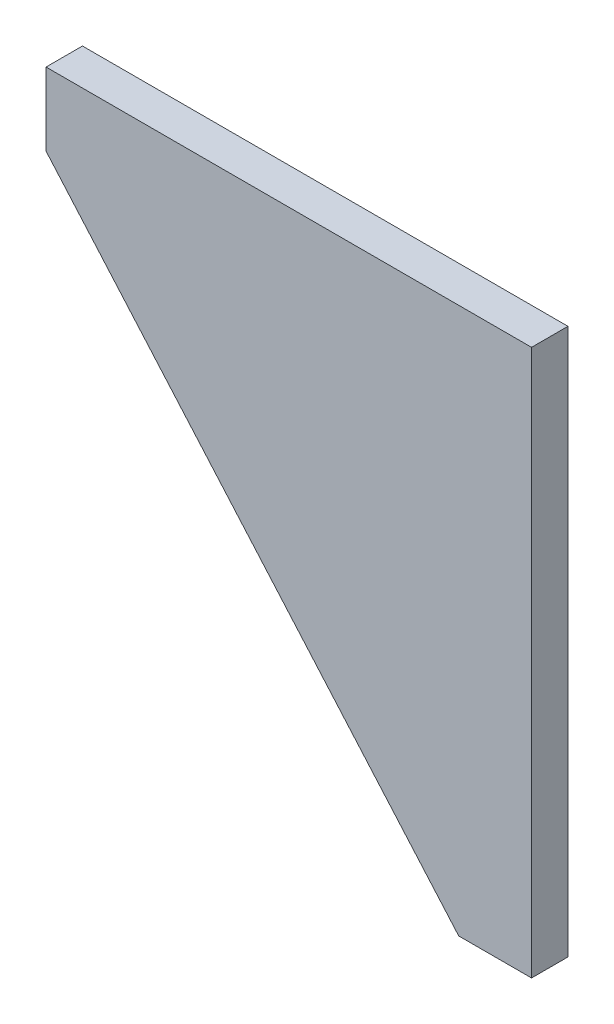
ISO-10303-21;
HEADER;
FILE_DESCRIPTION(('STEP AP214'),'2;1');
FILE_NAME('part.step','',(''),(''),'','','');
FILE_SCHEMA(('AUTOMOTIVE_DESIGN { 1 0 10303 214 1 1 1 1 }'));
ENDSEC;
DATA;
#1=APPLICATION_CONTEXT('core data for automotive mechanical design processes');
#2=APPLICATION_PROTOCOL_DEFINITION('international standard','automotive_design',2000,#1);
#3=PRODUCT_CONTEXT('',#1,'mechanical');
#4=PRODUCT('Part','Part','',(#3));
#5=PRODUCT_RELATED_PRODUCT_CATEGORY('part','',(#4));
#6=PRODUCT_DEFINITION_FORMATION('','',#4);
#7=PRODUCT_DEFINITION_CONTEXT('part definition',#1,'design');
#8=PRODUCT_DEFINITION('design','',#6,#7);
#9=PRODUCT_DEFINITION_SHAPE('','',#8);
#10=(LENGTH_UNIT() NAMED_UNIT(*) SI_UNIT(.MILLI.,.METRE.));
#11=(NAMED_UNIT(*) PLANE_ANGLE_UNIT() SI_UNIT($,.RADIAN.));
#12=(NAMED_UNIT(*) SI_UNIT($,.STERADIAN.) SOLID_ANGLE_UNIT());
#13=UNCERTAINTY_MEASURE_WITH_UNIT(LENGTH_MEASURE(1.E-05),#10,'distance_accuracy_value','');
#14=(GEOMETRIC_REPRESENTATION_CONTEXT(3) GLOBAL_UNCERTAINTY_ASSIGNED_CONTEXT((#13)) GLOBAL_UNIT_ASSIGNED_CONTEXT((#10,
#11,#12)) REPRESENTATION_CONTEXT('',''));
#15=CARTESIAN_POINT('',(0.,0.,0.));
#16=DIRECTION('',(0.,0.,1.));
#17=DIRECTION('',(1.,0.,0.));
#18=AXIS2_PLACEMENT_3D('',#15,#16,#17);
#19=CARTESIAN_POINT('',(0.,6.00000000000001,-3.));
#20=DIRECTION('',(1.,0.,0.));
#21=DIRECTION('',(0.,1.,0.));
#22=AXIS2_PLACEMENT_3D('',#19,#20,#21);
#23=PLANE('',#22);
#24=DIRECTION('',(0.,-1.,0.));
#25=VECTOR('',#24,1.);
#26=CARTESIAN_POINT('',(0.,6.00000000000001,0.));
#27=LINE('',#26,#25);
#28=CARTESIAN_POINT('',(0.,6.00000000000001,0.));
#29=VERTEX_POINT('',#28);
#30=CARTESIAN_POINT('',(0.,-39.,0.));
#31=VERTEX_POINT('',#30);
#32=EDGE_CURVE('E110',#29,#31,#27,.T.);
#33=ORIENTED_EDGE('',*,*,#32,.T.);
#34=DIRECTION('',(0.,0.,1.));
#35=VECTOR('',#34,1.);
#36=CARTESIAN_POINT('',(0.,-39.,-3.));
#37=LINE('',#36,#35);
#38=CARTESIAN_POINT('',(0.,-39.,-3.));
#39=VERTEX_POINT('',#38);
#40=EDGE_CURVE('E38',#39,#31,#37,.T.);
#41=ORIENTED_EDGE('',*,*,#40,.F.);
#42=DIRECTION('',(0.,-1.,0.));
#43=VECTOR('',#42,1.);
#44=CARTESIAN_POINT('',(0.,6.00000000000001,-3.));
#45=LINE('',#44,#43);
#46=CARTESIAN_POINT('',(0.,6.00000000000001,-3.));
#47=VERTEX_POINT('',#46);
#48=EDGE_CURVE('E117',#47,#39,#45,.T.);
#49=ORIENTED_EDGE('',*,*,#48,.F.);
#50=DIRECTION('',(0.,0.,1.));
#51=VECTOR('',#50,1.);
#52=CARTESIAN_POINT('',(0.,6.00000000000001,-3.));
#53=LINE('',#52,#51);
#54=EDGE_CURVE('E11',#47,#29,#53,.T.);
#55=ORIENTED_EDGE('',*,*,#54,.T.);
#56=EDGE_LOOP('',(#33,#41,#49,#55));
#57=FACE_BOUND('',#56,.T.);
#58=ADVANCED_FACE('F35',(#57),#23,.T.);
#59=CARTESIAN_POINT('',(-40.,5.99999999999983,-3.));
#60=DIRECTION('',(0.,1.,0.));
#61=DIRECTION('',(0.,0.,-1.));
#62=AXIS2_PLACEMENT_3D('',#59,#60,#61);
#63=PLANE('',#62);
#64=DIRECTION('',(1.,0.,0.));
#65=VECTOR('',#64,1.);
#66=CARTESIAN_POINT('',(-40.,5.99999999999983,0.));
#67=LINE('',#66,#65);
#68=CARTESIAN_POINT('',(-40.,5.99999999999983,0.));
#69=VERTEX_POINT('',#68);
#70=EDGE_CURVE('E79',#69,#29,#67,.T.);
#71=ORIENTED_EDGE('',*,*,#70,.T.);
#72=ORIENTED_EDGE('',*,*,#54,.F.);
#73=DIRECTION('',(1.,0.,0.));
#74=VECTOR('',#73,1.);
#75=CARTESIAN_POINT('',(-40.,5.99999999999983,-3.));
#76=LINE('',#75,#74);
#77=CARTESIAN_POINT('',(-40.,5.99999999999983,-3.));
#78=VERTEX_POINT('',#77);
#79=EDGE_CURVE('E53',#78,#47,#76,.T.);
#80=ORIENTED_EDGE('',*,*,#79,.F.);
#81=DIRECTION('',(0.,0.,1.));
#82=VECTOR('',#81,1.);
#83=CARTESIAN_POINT('',(-40.,5.99999999999983,-3.));
#84=LINE('',#83,#82);
#85=EDGE_CURVE('E44',#78,#69,#84,.T.);
#86=ORIENTED_EDGE('',*,*,#85,.T.);
#87=EDGE_LOOP('',(#71,#72,#80,#86));
#88=FACE_BOUND('',#87,.T.);
#89=ADVANCED_FACE('F134',(#88),#63,.T.);
#90=CARTESIAN_POINT('',(-40.,-1.80411241501588E-13,-3.));
#91=DIRECTION('',(-1.,0.,0.));
#92=DIRECTION('',(0.,0.,-1.));
#93=AXIS2_PLACEMENT_3D('',#90,#91,#92);
#94=PLANE('',#93);
#95=DIRECTION('',(0.,1.,0.));
#96=VECTOR('',#95,1.);
#97=CARTESIAN_POINT('',(-40.,-1.80411241501588E-13,0.));
#98=LINE('',#97,#96);
#99=CARTESIAN_POINT('',(-40.,-1.80411241501588E-13,0.));
#100=VERTEX_POINT('',#99);
#101=EDGE_CURVE('E73',#100,#69,#98,.T.);
#102=ORIENTED_EDGE('',*,*,#101,.T.);
#103=ORIENTED_EDGE('',*,*,#85,.F.);
#104=DIRECTION('',(0.,1.,0.));
#105=VECTOR('',#104,1.);
#106=CARTESIAN_POINT('',(-40.,-1.80411241501588E-13,-3.));
#107=LINE('',#106,#105);
#108=CARTESIAN_POINT('',(-40.,-1.80411241501588E-13,-3.));
#109=VERTEX_POINT('',#108);
#110=EDGE_CURVE('E95',#109,#78,#107,.T.);
#111=ORIENTED_EDGE('',*,*,#110,.F.);
#112=DIRECTION('',(0.,0.,1.));
#113=VECTOR('',#112,1.);
#114=CARTESIAN_POINT('',(-40.,-1.80411241501588E-13,-3.));
#115=LINE('',#114,#113);
#116=EDGE_CURVE('E99',#109,#100,#115,.T.);
#117=ORIENTED_EDGE('',*,*,#116,.T.);
#118=EDGE_LOOP('',(#102,#103,#111,#117));
#119=FACE_BOUND('',#118,.T.);
#120=ADVANCED_FACE('F105',(#119),#94,.T.);
#121=CARTESIAN_POINT('',(-6.00000000000001,-39.,-3.));
#122=DIRECTION('',(-0.753772729907787,-0.657135200432431,0.));
#123=DIRECTION('',(0.657135200432424,-0.753772729907782,0.));
#124=AXIS2_PLACEMENT_3D('',#121,#122,#123);
#125=PLANE('',#124);
#126=DIRECTION('',(-0.657135200432424,0.753772729907782,0.));
#127=VECTOR('',#126,1.);
#128=CARTESIAN_POINT('',(-6.00000000000001,-39.,0.));
#129=LINE('',#128,#127);
#130=CARTESIAN_POINT('',(-6.00000000000001,-39.,0.));
#131=VERTEX_POINT('',#130);
#132=EDGE_CURVE('E102',#131,#100,#129,.T.);
#133=ORIENTED_EDGE('',*,*,#132,.T.);
#134=ORIENTED_EDGE('',*,*,#116,.F.);
#135=DIRECTION('',(-0.657135200432424,0.753772729907782,0.));
#136=VECTOR('',#135,1.);
#137=CARTESIAN_POINT('',(-6.00000000000001,-39.,-3.));
#138=LINE('',#137,#136);
#139=CARTESIAN_POINT('',(-6.00000000000001,-39.,-3.));
#140=VERTEX_POINT('',#139);
#141=EDGE_CURVE('E91',#140,#109,#138,.T.);
#142=ORIENTED_EDGE('',*,*,#141,.F.);
#143=DIRECTION('',(0.,0.,1.));
#144=VECTOR('',#143,1.);
#145=CARTESIAN_POINT('',(-6.00000000000001,-39.,-3.));
#146=LINE('',#145,#144);
#147=EDGE_CURVE('E103',#140,#131,#146,.T.);
#148=ORIENTED_EDGE('',*,*,#147,.T.);
#149=EDGE_LOOP('',(#133,#134,#142,#148));
#150=FACE_BOUND('',#149,.T.);
#151=ADVANCED_FACE('F100',(#150),#125,.T.);
#152=CARTESIAN_POINT('',(0.,-39.,-3.));
#153=DIRECTION('',(0.,-1.,0.));
#154=DIRECTION('',(0.,0.,1.));
#155=AXIS2_PLACEMENT_3D('',#152,#153,#154);
#156=PLANE('',#155);
#157=DIRECTION('',(-1.,0.,0.));
#158=VECTOR('',#157,1.);
#159=CARTESIAN_POINT('',(0.,-39.,0.));
#160=LINE('',#159,#158);
#161=EDGE_CURVE('E113',#31,#131,#160,.T.);
#162=ORIENTED_EDGE('',*,*,#161,.T.);
#163=ORIENTED_EDGE('',*,*,#147,.F.);
#164=DIRECTION('',(-1.,0.,0.));
#165=VECTOR('',#164,1.);
#166=CARTESIAN_POINT('',(0.,-39.,-3.));
#167=LINE('',#166,#165);
#168=EDGE_CURVE('E87',#39,#140,#167,.T.);
#169=ORIENTED_EDGE('',*,*,#168,.F.);
#170=ORIENTED_EDGE('',*,*,#40,.T.);
#171=EDGE_LOOP('',(#162,#163,#169,#170));
#172=FACE_BOUND('',#171,.T.);
#173=ADVANCED_FACE('F120',(#172),#156,.T.);
#174=CARTESIAN_POINT('',(0.,-39.,-3.));
#175=DIRECTION('',(0.,0.,1.));
#176=DIRECTION('',(-1.,0.,0.));
#177=AXIS2_PLACEMENT_3D('',#174,#175,#176);
#178=PLANE('',#177);
#179=ORIENTED_EDGE('',*,*,#48,.T.);
#180=ORIENTED_EDGE('',*,*,#168,.T.);
#181=ORIENTED_EDGE('',*,*,#141,.T.);
#182=ORIENTED_EDGE('',*,*,#110,.T.);
#183=ORIENTED_EDGE('',*,*,#79,.T.);
#184=EDGE_LOOP('',(#179,#180,#181,#182,#183));
#185=FACE_BOUND('',#184,.T.);
#186=ADVANCED_FACE('F93',(#185),#178,.F.);
#187=CARTESIAN_POINT('',(0.,-39.,0.));
#188=DIRECTION('',(0.,0.,1.));
#189=DIRECTION('',(-1.,0.,0.));
#190=AXIS2_PLACEMENT_3D('',#187,#188,#189);
#191=PLANE('',#190);
#192=ORIENTED_EDGE('',*,*,#32,.F.);
#193=ORIENTED_EDGE('',*,*,#70,.F.);
#194=ORIENTED_EDGE('',*,*,#101,.F.);
#195=ORIENTED_EDGE('',*,*,#132,.F.);
#196=ORIENTED_EDGE('',*,*,#161,.F.);
#197=EDGE_LOOP('',(#192,#193,#194,#195,#196));
#198=FACE_BOUND('',#197,.T.);
#199=ADVANCED_FACE('F125',(#198),#191,.T.);
#200=CLOSED_SHELL('',(#58,#89,#120,#151,#173,#186,#199));
#201=MANIFOLD_SOLID_BREP('B2',#200);
#202=ADVANCED_BREP_SHAPE_REPRESENTATION('',(#18,#201),#14);
#203=SHAPE_DEFINITION_REPRESENTATION(#9,#202);
ENDSEC;
END-ISO-10303-21;
